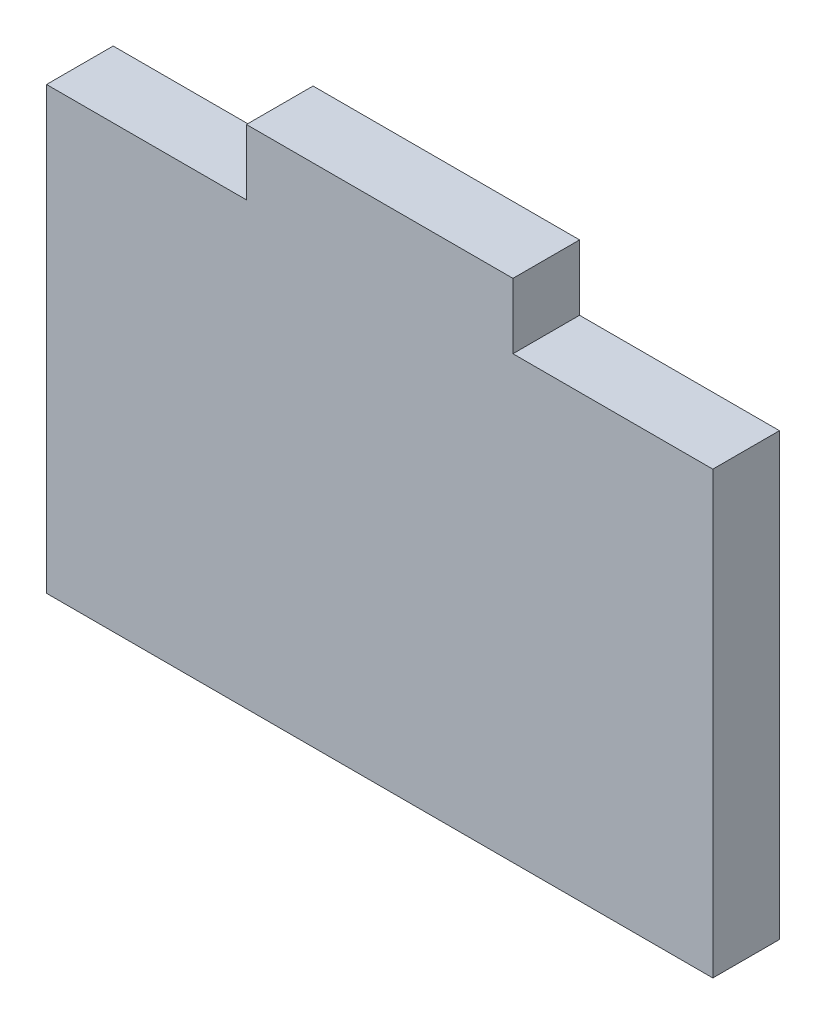
ISO-10303-21;
HEADER;
FILE_DESCRIPTION(('STEP AP214'),'2;1');
FILE_NAME('part.step','',(''),(''),'','','');
FILE_SCHEMA(('AUTOMOTIVE_DESIGN { 1 0 10303 214 1 1 1 1 }'));
ENDSEC;
DATA;
#1=APPLICATION_CONTEXT('core data for automotive mechanical design processes');
#2=APPLICATION_PROTOCOL_DEFINITION('international standard','automotive_design',2000,#1);
#3=PRODUCT_CONTEXT('',#1,'mechanical');
#4=PRODUCT('Part','Part','',(#3));
#5=PRODUCT_RELATED_PRODUCT_CATEGORY('part','',(#4));
#6=PRODUCT_DEFINITION_FORMATION('','',#4);
#7=PRODUCT_DEFINITION_CONTEXT('part definition',#1,'design');
#8=PRODUCT_DEFINITION('design','',#6,#7);
#9=PRODUCT_DEFINITION_SHAPE('','',#8);
#10=(LENGTH_UNIT() NAMED_UNIT(*) SI_UNIT(.MILLI.,.METRE.));
#11=(NAMED_UNIT(*) PLANE_ANGLE_UNIT() SI_UNIT($,.RADIAN.));
#12=(NAMED_UNIT(*) SI_UNIT($,.STERADIAN.) SOLID_ANGLE_UNIT());
#13=UNCERTAINTY_MEASURE_WITH_UNIT(LENGTH_MEASURE(1.E-05),#10,'distance_accuracy_value','');
#14=(GEOMETRIC_REPRESENTATION_CONTEXT(3) GLOBAL_UNCERTAINTY_ASSIGNED_CONTEXT((#13)) GLOBAL_UNIT_ASSIGNED_CONTEXT((#10,
#11,#12)) REPRESENTATION_CONTEXT('',''));
#15=CARTESIAN_POINT('',(0.,0.,0.));
#16=DIRECTION('',(0.,0.,1.));
#17=DIRECTION('',(1.,0.,0.));
#18=AXIS2_PLACEMENT_3D('',#15,#16,#17);
#19=CARTESIAN_POINT('',(0.,0.,6.35));
#20=DIRECTION('',(-1.,0.,0.));
#21=DIRECTION('',(0.,-1.,0.));
#22=AXIS2_PLACEMENT_3D('',#19,#20,#21);
#23=PLANE('',#22);
#24=DIRECTION('',(0.,0.,1.));
#25=VECTOR('',#24,1.);
#26=CARTESIAN_POINT('',(0.,53.377,0.));
#27=LINE('',#26,#25);
#28=CARTESIAN_POINT('',(0.,53.377,0.));
#29=VERTEX_POINT('',#28);
#30=CARTESIAN_POINT('',(0.,53.377,6.35));
#31=VERTEX_POINT('',#30);
#32=EDGE_CURVE('E55',#29,#31,#27,.T.);
#33=ORIENTED_EDGE('',*,*,#32,.T.);
#34=DIRECTION('',(0.,1.,0.));
#35=VECTOR('',#34,1.);
#36=CARTESIAN_POINT('',(0.,0.,6.35));
#37=LINE('',#36,#35);
#38=CARTESIAN_POINT('',(0.,95.377,6.35));
#39=VERTEX_POINT('',#38);
#40=EDGE_CURVE('E62',#31,#39,#37,.T.);
#41=ORIENTED_EDGE('',*,*,#40,.T.);
#42=DIRECTION('',(0.,0.,-1.));
#43=VECTOR('',#42,1.);
#44=CARTESIAN_POINT('',(0.,95.377,6.35));
#45=LINE('',#44,#43);
#46=CARTESIAN_POINT('',(0.,95.377,0.));
#47=VERTEX_POINT('',#46);
#48=EDGE_CURVE('E147',#39,#47,#45,.T.);
#49=ORIENTED_EDGE('',*,*,#48,.T.);
#50=DIRECTION('',(0.,1.,0.));
#51=VECTOR('',#50,1.);
#52=CARTESIAN_POINT('',(0.,0.,0.));
#53=LINE('',#52,#51);
#54=EDGE_CURVE('E90',#29,#47,#53,.T.);
#55=ORIENTED_EDGE('',*,*,#54,.F.);
#56=EDGE_LOOP('',(#33,#41,#49,#55));
#57=FACE_BOUND('',#56,.T.);
#58=ADVANCED_FACE('F40',(#57),#23,.T.);
#59=CARTESIAN_POINT('',(63.5,0.,6.35));
#60=DIRECTION('',(1.,0.,0.));
#61=DIRECTION('',(0.,1.,0.));
#62=AXIS2_PLACEMENT_3D('',#59,#60,#61);
#63=PLANE('',#62);
#64=DIRECTION('',(0.,0.,1.));
#65=VECTOR('',#64,1.);
#66=CARTESIAN_POINT('',(63.5,53.377,6.35));
#67=LINE('',#66,#65);
#68=CARTESIAN_POINT('',(63.5,53.377,0.));
#69=VERTEX_POINT('',#68);
#70=CARTESIAN_POINT('',(63.5,53.377,6.35));
#71=VERTEX_POINT('',#70);
#72=EDGE_CURVE('E151',#69,#71,#67,.T.);
#73=ORIENTED_EDGE('',*,*,#72,.F.);
#74=DIRECTION('',(0.,-1.,0.));
#75=VECTOR('',#74,1.);
#76=CARTESIAN_POINT('',(63.5,0.,0.));
#77=LINE('',#76,#75);
#78=CARTESIAN_POINT('',(63.5,95.377,0.));
#79=VERTEX_POINT('',#78);
#80=EDGE_CURVE('E150',#79,#69,#77,.T.);
#81=ORIENTED_EDGE('',*,*,#80,.F.);
#82=DIRECTION('',(0.,0.,-1.));
#83=VECTOR('',#82,1.);
#84=CARTESIAN_POINT('',(63.5,95.377,6.35));
#85=LINE('',#84,#83);
#86=CARTESIAN_POINT('',(63.5,95.377,6.35));
#87=VERTEX_POINT('',#86);
#88=EDGE_CURVE('E48',#87,#79,#85,.T.);
#89=ORIENTED_EDGE('',*,*,#88,.F.);
#90=DIRECTION('',(0.,-1.,0.));
#91=VECTOR('',#90,1.);
#92=CARTESIAN_POINT('',(63.5,0.,6.35));
#93=LINE('',#92,#91);
#94=EDGE_CURVE('E191',#87,#71,#93,.T.);
#95=ORIENTED_EDGE('',*,*,#94,.T.);
#96=EDGE_LOOP('',(#73,#81,#89,#95));
#97=FACE_BOUND('',#96,.T.);
#98=ADVANCED_FACE('F185',(#97),#63,.T.);
#99=CARTESIAN_POINT('',(0.,95.377,6.35));
#100=DIRECTION('',(0.,1.,0.));
#101=DIRECTION('',(0.,0.,1.));
#102=AXIS2_PLACEMENT_3D('',#99,#100,#101);
#103=PLANE('',#102);
#104=DIRECTION('',(1.,0.,0.));
#105=VECTOR('',#104,1.);
#106=CARTESIAN_POINT('',(0.,95.377,0.));
#107=LINE('',#106,#105);
#108=CARTESIAN_POINT('',(44.45,95.377,0.));
#109=VERTEX_POINT('',#108);
#110=EDGE_CURVE('E155',#109,#79,#107,.T.);
#111=ORIENTED_EDGE('',*,*,#110,.F.);
#112=DIRECTION('',(0.,0.,-1.));
#113=VECTOR('',#112,1.);
#114=CARTESIAN_POINT('',(44.45,95.377,6.35));
#115=LINE('',#114,#113);
#116=CARTESIAN_POINT('',(44.45,95.377,6.35));
#117=VERTEX_POINT('',#116);
#118=EDGE_CURVE('E177',#117,#109,#115,.T.);
#119=ORIENTED_EDGE('',*,*,#118,.F.);
#120=DIRECTION('',(1.,0.,0.));
#121=VECTOR('',#120,1.);
#122=CARTESIAN_POINT('',(0.,95.377,6.35));
#123=LINE('',#122,#121);
#124=EDGE_CURVE('E141',#117,#87,#123,.T.);
#125=ORIENTED_EDGE('',*,*,#124,.T.);
#126=ORIENTED_EDGE('',*,*,#88,.T.);
#127=EDGE_LOOP('',(#111,#119,#125,#126));
#128=FACE_BOUND('',#127,.T.);
#129=ADVANCED_FACE('F183',(#128),#103,.T.);
#130=CARTESIAN_POINT('',(44.45,0.,6.35));
#131=DIRECTION('',(1.,0.,0.));
#132=DIRECTION('',(0.,0.,-1.));
#133=AXIS2_PLACEMENT_3D('',#130,#131,#132);
#134=PLANE('',#133);
#135=DIRECTION('',(0.,-1.,0.));
#136=VECTOR('',#135,1.);
#137=CARTESIAN_POINT('',(44.45,0.,0.));
#138=LINE('',#137,#136);
#139=CARTESIAN_POINT('',(44.45,101.6,0.));
#140=VERTEX_POINT('',#139);
#141=EDGE_CURVE('E159',#140,#109,#138,.T.);
#142=ORIENTED_EDGE('',*,*,#141,.F.);
#143=DIRECTION('',(0.,0.,-1.));
#144=VECTOR('',#143,1.);
#145=CARTESIAN_POINT('',(44.45,101.6,6.35));
#146=LINE('',#145,#144);
#147=CARTESIAN_POINT('',(44.45,101.6,6.35));
#148=VERTEX_POINT('',#147);
#149=EDGE_CURVE('E120',#148,#140,#146,.T.);
#150=ORIENTED_EDGE('',*,*,#149,.F.);
#151=DIRECTION('',(0.,-1.,0.));
#152=VECTOR('',#151,1.);
#153=CARTESIAN_POINT('',(44.45,0.,6.35));
#154=LINE('',#153,#152);
#155=EDGE_CURVE('E137',#148,#117,#154,.T.);
#156=ORIENTED_EDGE('',*,*,#155,.T.);
#157=ORIENTED_EDGE('',*,*,#118,.T.);
#158=EDGE_LOOP('',(#142,#150,#156,#157));
#159=FACE_BOUND('',#158,.T.);
#160=ADVANCED_FACE('F190',(#159),#134,.T.);
#161=CARTESIAN_POINT('',(0.,101.6,6.35));
#162=DIRECTION('',(0.,1.,0.));
#163=DIRECTION('',(-1.,0.,0.));
#164=AXIS2_PLACEMENT_3D('',#161,#162,#163);
#165=PLANE('',#164);
#166=DIRECTION('',(1.,0.,0.));
#167=VECTOR('',#166,1.);
#168=CARTESIAN_POINT('',(0.,101.6,0.));
#169=LINE('',#168,#167);
#170=CARTESIAN_POINT('',(19.05,101.6,0.));
#171=VERTEX_POINT('',#170);
#172=EDGE_CURVE('E115',#171,#140,#169,.T.);
#173=ORIENTED_EDGE('',*,*,#172,.F.);
#174=DIRECTION('',(0.,0.,-1.));
#175=VECTOR('',#174,1.);
#176=CARTESIAN_POINT('',(19.05,101.6,6.35));
#177=LINE('',#176,#175);
#178=CARTESIAN_POINT('',(19.05,101.6,6.35));
#179=VERTEX_POINT('',#178);
#180=EDGE_CURVE('E109',#179,#171,#177,.T.);
#181=ORIENTED_EDGE('',*,*,#180,.F.);
#182=DIRECTION('',(1.,0.,0.));
#183=VECTOR('',#182,1.);
#184=CARTESIAN_POINT('',(0.,101.6,6.35));
#185=LINE('',#184,#183);
#186=EDGE_CURVE('E113',#179,#148,#185,.T.);
#187=ORIENTED_EDGE('',*,*,#186,.T.);
#188=ORIENTED_EDGE('',*,*,#149,.T.);
#189=EDGE_LOOP('',(#173,#181,#187,#188));
#190=FACE_BOUND('',#189,.T.);
#191=ADVANCED_FACE('F111',(#190),#165,.T.);
#192=CARTESIAN_POINT('',(19.05,0.,6.35));
#193=DIRECTION('',(1.,0.,0.));
#194=DIRECTION('',(0.,1.,0.));
#195=AXIS2_PLACEMENT_3D('',#192,#193,#194);
#196=PLANE('',#195);
#197=DIRECTION('',(0.,-1.,0.));
#198=VECTOR('',#197,1.);
#199=CARTESIAN_POINT('',(19.05,0.,0.));
#200=LINE('',#199,#198);
#201=CARTESIAN_POINT('',(19.05,95.377,0.));
#202=VERTEX_POINT('',#201);
#203=EDGE_CURVE('E165',#171,#202,#200,.T.);
#204=ORIENTED_EDGE('',*,*,#203,.T.);
#205=DIRECTION('',(0.,0.,-1.));
#206=VECTOR('',#205,1.);
#207=CARTESIAN_POINT('',(19.05,95.377,6.35));
#208=LINE('',#207,#206);
#209=CARTESIAN_POINT('',(19.05,95.377,6.35));
#210=VERTEX_POINT('',#209);
#211=EDGE_CURVE('E121',#210,#202,#208,.T.);
#212=ORIENTED_EDGE('',*,*,#211,.F.);
#213=DIRECTION('',(0.,-1.,0.));
#214=VECTOR('',#213,1.);
#215=CARTESIAN_POINT('',(19.05,0.,6.35));
#216=LINE('',#215,#214);
#217=EDGE_CURVE('E124',#179,#210,#216,.T.);
#218=ORIENTED_EDGE('',*,*,#217,.F.);
#219=ORIENTED_EDGE('',*,*,#180,.T.);
#220=EDGE_LOOP('',(#204,#212,#218,#219));
#221=FACE_BOUND('',#220,.T.);
#222=ADVANCED_FACE('F125',(#221),#196,.F.);
#223=CARTESIAN_POINT('',(0.,95.377,6.35));
#224=DIRECTION('',(0.,1.,0.));
#225=DIRECTION('',(0.,0.,1.));
#226=AXIS2_PLACEMENT_3D('',#223,#224,#225);
#227=PLANE('',#226);
#228=DIRECTION('',(1.,0.,0.));
#229=VECTOR('',#228,1.);
#230=CARTESIAN_POINT('',(0.,95.377,0.));
#231=LINE('',#230,#229);
#232=EDGE_CURVE('E168',#47,#202,#231,.T.);
#233=ORIENTED_EDGE('',*,*,#232,.F.);
#234=ORIENTED_EDGE('',*,*,#48,.F.);
#235=DIRECTION('',(1.,0.,0.));
#236=VECTOR('',#235,1.);
#237=CARTESIAN_POINT('',(0.,95.377,6.35));
#238=LINE('',#237,#236);
#239=EDGE_CURVE('E130',#39,#210,#238,.T.);
#240=ORIENTED_EDGE('',*,*,#239,.T.);
#241=ORIENTED_EDGE('',*,*,#211,.T.);
#242=EDGE_LOOP('',(#233,#234,#240,#241));
#243=FACE_BOUND('',#242,.T.);
#244=ADVANCED_FACE('F210',(#243),#227,.T.);
#245=CARTESIAN_POINT('',(0.,0.,6.35));
#246=DIRECTION('',(0.,0.,1.));
#247=DIRECTION('',(1.,0.,0.));
#248=AXIS2_PLACEMENT_3D('',#245,#246,#247);
#249=PLANE('',#248);
#250=DIRECTION('',(-1.,0.,0.));
#251=VECTOR('',#250,1.);
#252=CARTESIAN_POINT('',(0.,53.377,6.35));
#253=LINE('',#252,#251);
#254=EDGE_CURVE('E202',#71,#31,#253,.T.);
#255=ORIENTED_EDGE('',*,*,#254,.F.);
#256=ORIENTED_EDGE('',*,*,#94,.F.);
#257=ORIENTED_EDGE('',*,*,#124,.F.);
#258=ORIENTED_EDGE('',*,*,#155,.F.);
#259=ORIENTED_EDGE('',*,*,#186,.F.);
#260=ORIENTED_EDGE('',*,*,#217,.T.);
#261=ORIENTED_EDGE('',*,*,#239,.F.);
#262=ORIENTED_EDGE('',*,*,#40,.F.);
#263=EDGE_LOOP('',(#255,#256,#257,#258,#259,#260,#261,#262));
#264=FACE_BOUND('',#263,.T.);
#265=ADVANCED_FACE('F134',(#264),#249,.T.);
#266=CARTESIAN_POINT('',(0.,0.,0.));
#267=DIRECTION('',(0.,0.,1.));
#268=DIRECTION('',(1.,0.,0.));
#269=AXIS2_PLACEMENT_3D('',#266,#267,#268);
#270=PLANE('',#269);
#271=ORIENTED_EDGE('',*,*,#80,.T.);
#272=DIRECTION('',(-1.,0.,0.));
#273=VECTOR('',#272,1.);
#274=CARTESIAN_POINT('',(0.,53.377,0.));
#275=LINE('',#274,#273);
#276=EDGE_CURVE('E11',#69,#29,#275,.T.);
#277=ORIENTED_EDGE('',*,*,#276,.T.);
#278=ORIENTED_EDGE('',*,*,#54,.T.);
#279=ORIENTED_EDGE('',*,*,#232,.T.);
#280=ORIENTED_EDGE('',*,*,#203,.F.);
#281=ORIENTED_EDGE('',*,*,#172,.T.);
#282=ORIENTED_EDGE('',*,*,#141,.T.);
#283=ORIENTED_EDGE('',*,*,#110,.T.);
#284=EDGE_LOOP('',(#271,#277,#278,#279,#280,#281,#282,#283));
#285=FACE_BOUND('',#284,.T.);
#286=ADVANCED_FACE('F187',(#285),#270,.F.);
#287=CARTESIAN_POINT('',(0.,53.377,0.));
#288=DIRECTION('',(0.,1.,0.));
#289=DIRECTION('',(0.,0.,1.));
#290=AXIS2_PLACEMENT_3D('',#287,#288,#289);
#291=PLANE('',#290);
#292=ORIENTED_EDGE('',*,*,#72,.T.);
#293=ORIENTED_EDGE('',*,*,#254,.T.);
#294=ORIENTED_EDGE('',*,*,#32,.F.);
#295=ORIENTED_EDGE('',*,*,#276,.F.);
#296=EDGE_LOOP('',(#292,#293,#294,#295));
#297=FACE_BOUND('',#296,.T.);
#298=ADVANCED_FACE('F205',(#297),#291,.F.);
#299=CLOSED_SHELL('',(#58,#98,#129,#160,#191,#222,#244,#265,#286,#298));
#300=MANIFOLD_SOLID_BREP('B2',#299);
#301=ADVANCED_BREP_SHAPE_REPRESENTATION('',(#18,#300),#14);
#302=SHAPE_DEFINITION_REPRESENTATION(#9,#301);
ENDSEC;
END-ISO-10303-21;
